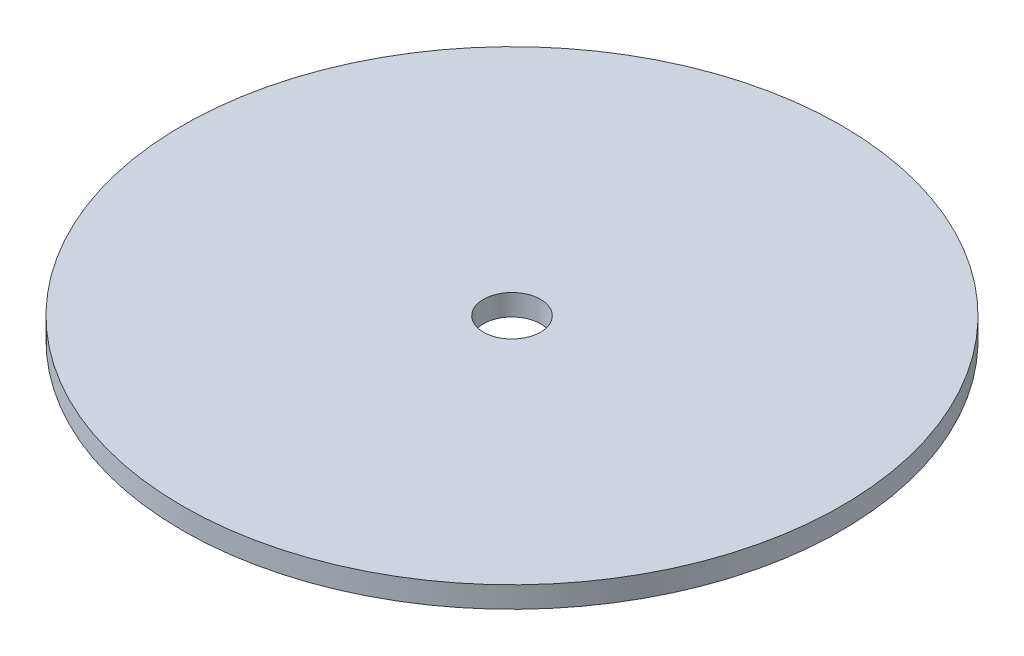
ISO-10303-21;
HEADER;
FILE_DESCRIPTION(('STEP AP214'),'2;1');
FILE_NAME('part.step','',(''),(''),'','','');
FILE_SCHEMA(('AUTOMOTIVE_DESIGN { 1 0 10303 214 1 1 1 1 }'));
ENDSEC;
DATA;
#1=APPLICATION_CONTEXT('core data for automotive mechanical design processes');
#2=APPLICATION_PROTOCOL_DEFINITION('international standard','automotive_design',2000,#1);
#3=PRODUCT_CONTEXT('',#1,'mechanical');
#4=PRODUCT('Part','Part','',(#3));
#5=PRODUCT_RELATED_PRODUCT_CATEGORY('part','',(#4));
#6=PRODUCT_DEFINITION_FORMATION('','',#4);
#7=PRODUCT_DEFINITION_CONTEXT('part definition',#1,'design');
#8=PRODUCT_DEFINITION('design','',#6,#7);
#9=PRODUCT_DEFINITION_SHAPE('','',#8);
#10=(LENGTH_UNIT() NAMED_UNIT(*) SI_UNIT(.MILLI.,.METRE.));
#11=(NAMED_UNIT(*) PLANE_ANGLE_UNIT() SI_UNIT($,.RADIAN.));
#12=(NAMED_UNIT(*) SI_UNIT($,.STERADIAN.) SOLID_ANGLE_UNIT());
#13=UNCERTAINTY_MEASURE_WITH_UNIT(LENGTH_MEASURE(1.E-05),#10,'distance_accuracy_value','');
#14=(GEOMETRIC_REPRESENTATION_CONTEXT(3) GLOBAL_UNCERTAINTY_ASSIGNED_CONTEXT((#13)) GLOBAL_UNIT_ASSIGNED_CONTEXT((#10,
#11,#12)) REPRESENTATION_CONTEXT('',''));
#15=CARTESIAN_POINT('',(0.,0.,0.));
#16=DIRECTION('',(0.,0.,1.));
#17=DIRECTION('',(1.,0.,0.));
#18=AXIS2_PLACEMENT_3D('',#15,#16,#17);
#19=CARTESIAN_POINT('',(0.,3.22,0.));
#20=DIRECTION('',(0.,-1.,0.));
#21=DIRECTION('',(0.,0.,-1.));
#22=AXIS2_PLACEMENT_3D('',#19,#20,#21);
#23=CYLINDRICAL_SURFACE('',#22,50.);
#24=CARTESIAN_POINT('',(0.,3.22,0.));
#25=DIRECTION('',(0.,1.,0.));
#26=DIRECTION('',(0.,0.,1.));
#27=AXIS2_PLACEMENT_3D('',#24,#25,#26);
#28=CIRCLE('',#27,50.);
#29=CARTESIAN_POINT('',(0.,3.22,-50.));
#30=VERTEX_POINT('',#29);
#31=EDGE_CURVE('E10',#30,#30,#28,.T.);
#32=CARTESIAN_POINT('',(0.,0.,0.));
#33=DIRECTION('',(0.,1.,0.));
#34=DIRECTION('',(0.,0.,1.));
#35=AXIS2_PLACEMENT_3D('',#32,#33,#34);
#36=CIRCLE('',#35,50.);
#37=CARTESIAN_POINT('',(0.,0.,-50.));
#38=VERTEX_POINT('',#37);
#39=EDGE_CURVE('E37',#38,#38,#36,.T.);
#40=CARTESIAN_POINT('',(0.,3.22,-50.));
#41=CARTESIAN_POINT('',(0.,3.18645833333333,-50.));
#42=CARTESIAN_POINT('',(0.,3.15291666666667,-50.));
#43=CARTESIAN_POINT('',(0.,3.08583333333333,-50.));
#44=CARTESIAN_POINT('',(0.,3.05229166666667,-50.));
#45=CARTESIAN_POINT('',(0.,2.98520833333333,-50.));
#46=CARTESIAN_POINT('',(0.,2.95166666666667,-50.));
#47=CARTESIAN_POINT('',(0.,2.88458333333333,-50.));
#48=CARTESIAN_POINT('',(0.,2.85104166666667,-50.));
#49=CARTESIAN_POINT('',(0.,2.78395833333333,-50.));
#50=CARTESIAN_POINT('',(0.,2.75041666666667,-50.));
#51=CARTESIAN_POINT('',(0.,2.68333333333333,-50.));
#52=CARTESIAN_POINT('',(0.,2.64979166666667,-50.));
#53=CARTESIAN_POINT('',(0.,2.58270833333333,-50.));
#54=CARTESIAN_POINT('',(0.,2.54916666666667,-50.));
#55=CARTESIAN_POINT('',(0.,2.48208333333333,-50.));
#56=CARTESIAN_POINT('',(0.,2.44854166666667,-50.));
#57=CARTESIAN_POINT('',(0.,2.38145833333333,-50.));
#58=CARTESIAN_POINT('',(0.,2.34791666666667,-50.));
#59=CARTESIAN_POINT('',(0.,2.28083333333333,-50.));
#60=CARTESIAN_POINT('',(0.,2.24729166666667,-50.));
#61=CARTESIAN_POINT('',(0.,2.18020833333333,-50.));
#62=CARTESIAN_POINT('',(0.,2.14666666666667,-50.));
#63=CARTESIAN_POINT('',(0.,2.07958333333333,-50.));
#64=CARTESIAN_POINT('',(0.,2.04604166666667,-50.));
#65=CARTESIAN_POINT('',(0.,1.97895833333333,-50.));
#66=CARTESIAN_POINT('',(0.,1.94541666666667,-50.));
#67=CARTESIAN_POINT('',(0.,1.87833333333333,-50.));
#68=CARTESIAN_POINT('',(0.,1.84479166666667,-50.));
#69=CARTESIAN_POINT('',(0.,1.77770833333333,-50.));
#70=CARTESIAN_POINT('',(0.,1.74416666666667,-50.));
#71=CARTESIAN_POINT('',(0.,1.67708333333333,-50.));
#72=CARTESIAN_POINT('',(0.,1.64354166666667,-50.));
#73=CARTESIAN_POINT('',(0.,1.57645833333333,-50.));
#74=CARTESIAN_POINT('',(0.,1.54291666666667,-50.));
#75=CARTESIAN_POINT('',(0.,1.47583333333333,-50.));
#76=CARTESIAN_POINT('',(0.,1.44229166666667,-50.));
#77=CARTESIAN_POINT('',(0.,1.37520833333333,-50.));
#78=CARTESIAN_POINT('',(0.,1.34166666666667,-50.));
#79=CARTESIAN_POINT('',(0.,1.27458333333333,-50.));
#80=CARTESIAN_POINT('',(0.,1.24104166666667,-50.));
#81=CARTESIAN_POINT('',(0.,1.17395833333333,-50.));
#82=CARTESIAN_POINT('',(0.,1.14041666666667,-50.));
#83=CARTESIAN_POINT('',(0.,1.07333333333333,-50.));
#84=CARTESIAN_POINT('',(0.,1.03979166666667,-50.));
#85=CARTESIAN_POINT('',(0.,0.972708333333334,-50.));
#86=CARTESIAN_POINT('',(0.,0.939166666666667,-50.));
#87=CARTESIAN_POINT('',(0.,0.872083333333334,-50.));
#88=CARTESIAN_POINT('',(0.,0.838541666666667,-50.));
#89=CARTESIAN_POINT('',(0.,0.771458333333333,-50.));
#90=CARTESIAN_POINT('',(0.,0.737916666666667,-50.));
#91=CARTESIAN_POINT('',(0.,0.670833333333334,-50.));
#92=CARTESIAN_POINT('',(0.,0.637291666666667,-50.));
#93=CARTESIAN_POINT('',(0.,0.570208333333333,-50.));
#94=CARTESIAN_POINT('',(0.,0.536666666666667,-50.));
#95=CARTESIAN_POINT('',(0.,0.469583333333333,-50.));
#96=CARTESIAN_POINT('',(0.,0.436041666666667,-50.));
#97=CARTESIAN_POINT('',(0.,0.368958333333333,-50.));
#98=CARTESIAN_POINT('',(0.,0.335416666666667,-50.));
#99=CARTESIAN_POINT('',(0.,0.268333333333333,-50.));
#100=CARTESIAN_POINT('',(0.,0.234791666666667,-50.));
#101=CARTESIAN_POINT('',(0.,0.167708333333333,-50.));
#102=CARTESIAN_POINT('',(0.,0.134166666666667,-50.));
#103=CARTESIAN_POINT('',(0.,0.0670833333333334,-50.));
#104=CARTESIAN_POINT('',(0.,0.0335416666666667,-50.));
#105=CARTESIAN_POINT('',(0.,0.,-50.));
#106=B_SPLINE_CURVE_WITH_KNOTS('',3,(#40,#41,#42,#43,#44,#45,#46,#47,#48,#49,#50,#51,#52,#53,
#54,#55,#56,#57,#58,#59,#60,#61,#62,#63,#64,#65,#66,#67,#68,#69,#70,#71,#72,#73,#74,#75,#76,#77,
#78,#79,#80,#81,#82,#83,#84,#85,#86,#87,#88,#89,#90,#91,#92,#93,#94,#95,#96,#97,#98,#99,#100,
#101,#102,#103,#104,#105),.UNSPECIFIED.,.F.,.F.,(4,2,2,2,2,2,2,2,2,2,2,2,2,2,2,2,2,2,2,2,2,2,2,
2,2,2,2,2,2,2,2,2,4),(0.,0.100625,0.20125,0.301875,0.4025,0.503125,0.60375,0.704375,0.805,
0.905625,1.00625,1.106875,1.2075,1.308125,1.40875,1.509375,1.61,1.710625,1.81125,1.911875,
2.0125,2.113125,2.21375,2.314375,2.415,2.515625,2.61625,2.716875,2.8175,2.918125,3.01875,
3.119375,3.22),.UNSPECIFIED.);
#107=EDGE_CURVE('BSEAM30',#30,#38,#106,.T.);
#108=ORIENTED_EDGE('',*,*,#31,.F.);
#109=ORIENTED_EDGE('',*,*,#39,.T.);
#110=ORIENTED_EDGE('',*,*,#107,.T.);
#111=ORIENTED_EDGE('',*,*,#107,.F.);
#112=EDGE_LOOP('',(#108,#110,#109,#111));
#113=FACE_BOUND('',#112,.T.);
#114=ADVANCED_FACE('F30',(#113),#23,.T.);
#115=CARTESIAN_POINT('',(0.,3.22,0.));
#116=DIRECTION('',(0.,1.,0.));
#117=DIRECTION('',(0.,0.,1.));
#118=AXIS2_PLACEMENT_3D('',#115,#116,#117);
#119=PLANE('',#118);
#120=CARTESIAN_POINT('',(0.,3.22,0.));
#121=DIRECTION('',(0.,1.,0.));
#122=DIRECTION('',(0.,0.,1.));
#123=AXIS2_PLACEMENT_3D('',#120,#121,#122);
#124=CIRCLE('',#123,4.325);
#125=CARTESIAN_POINT('',(0.,3.22,4.325));
#126=VERTEX_POINT('',#125);
#127=EDGE_CURVE('E43',#126,#126,#124,.T.);
#128=ORIENTED_EDGE('',*,*,#127,.F.);
#129=EDGE_LOOP('',(#128));
#130=FACE_BOUND('',#129,.T.);
#131=ORIENTED_EDGE('',*,*,#31,.T.);
#132=EDGE_LOOP('',(#131));
#133=FACE_BOUND('',#132,.T.);
#134=ADVANCED_FACE('F59',(#130,#133),#119,.T.);
#135=CARTESIAN_POINT('',(0.,0.,0.));
#136=DIRECTION('',(0.,1.,0.));
#137=DIRECTION('',(0.,0.,1.));
#138=AXIS2_PLACEMENT_3D('',#135,#136,#137);
#139=PLANE('',#138);
#140=CARTESIAN_POINT('',(0.,0.,0.));
#141=DIRECTION('',(0.,1.,0.));
#142=DIRECTION('',(0.,0.,1.));
#143=AXIS2_PLACEMENT_3D('',#140,#141,#142);
#144=CIRCLE('',#143,4.325);
#145=CARTESIAN_POINT('',(0.,0.,4.325));
#146=VERTEX_POINT('',#145);
#147=EDGE_CURVE('E33',#146,#146,#144,.T.);
#148=ORIENTED_EDGE('',*,*,#147,.T.);
#149=EDGE_LOOP('',(#148));
#150=FACE_BOUND('',#149,.T.);
#151=ORIENTED_EDGE('',*,*,#39,.F.);
#152=EDGE_LOOP('',(#151));
#153=FACE_BOUND('',#152,.T.);
#154=ADVANCED_FACE('F50',(#150,#153),#139,.F.);
#155=CARTESIAN_POINT('',(0.,-1.41,0.));
#156=DIRECTION('',(0.,1.,0.));
#157=DIRECTION('',(0.,0.,1.));
#158=AXIS2_PLACEMENT_3D('',#155,#156,#157);
#159=CYLINDRICAL_SURFACE('',#158,4.325);
#160=ORIENTED_EDGE('',*,*,#127,.T.);
#161=EDGE_LOOP('',(#160));
#162=FACE_BOUND('',#161,.T.);
#163=ORIENTED_EDGE('',*,*,#147,.F.);
#164=EDGE_LOOP('',(#163));
#165=FACE_BOUND('',#164,.T.);
#166=ADVANCED_FACE('F53',(#162,#165),#159,.F.);
#167=CLOSED_SHELL('',(#114,#134,#154,#166));
#168=MANIFOLD_SOLID_BREP('B2',#167);
#169=ADVANCED_BREP_SHAPE_REPRESENTATION('',(#18,#168),#14);
#170=SHAPE_DEFINITION_REPRESENTATION(#9,#169);
ENDSEC;
END-ISO-10303-21;
